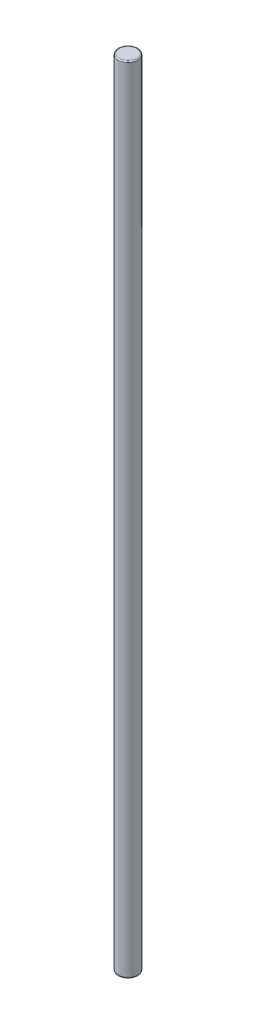
ISO-10303-21;
HEADER;
FILE_DESCRIPTION(('STEP AP214'),'2;1');
FILE_NAME('part.step','',(''),(''),'','','');
FILE_SCHEMA(('AUTOMOTIVE_DESIGN { 1 0 10303 214 1 1 1 1 }'));
ENDSEC;
DATA;
#1=APPLICATION_CONTEXT('core data for automotive mechanical design processes');
#2=APPLICATION_PROTOCOL_DEFINITION('international standard','automotive_design',2000,#1);
#3=PRODUCT_CONTEXT('',#1,'mechanical');
#4=PRODUCT('Part','Part','',(#3));
#5=PRODUCT_RELATED_PRODUCT_CATEGORY('part','',(#4));
#6=PRODUCT_DEFINITION_FORMATION('','',#4);
#7=PRODUCT_DEFINITION_CONTEXT('part definition',#1,'design');
#8=PRODUCT_DEFINITION('design','',#6,#7);
#9=PRODUCT_DEFINITION_SHAPE('','',#8);
#10=(LENGTH_UNIT() NAMED_UNIT(*) SI_UNIT(.MILLI.,.METRE.));
#11=(NAMED_UNIT(*) PLANE_ANGLE_UNIT() SI_UNIT($,.RADIAN.));
#12=(NAMED_UNIT(*) SI_UNIT($,.STERADIAN.) SOLID_ANGLE_UNIT());
#13=UNCERTAINTY_MEASURE_WITH_UNIT(LENGTH_MEASURE(1.E-05),#10,'distance_accuracy_value','');
#14=(GEOMETRIC_REPRESENTATION_CONTEXT(3) GLOBAL_UNCERTAINTY_ASSIGNED_CONTEXT((#13)) GLOBAL_UNIT_ASSIGNED_CONTEXT((#10,
#11,#12)) REPRESENTATION_CONTEXT('',''));
#15=CARTESIAN_POINT('',(0.,0.,0.));
#16=DIRECTION('',(0.,0.,1.));
#17=DIRECTION('',(1.,0.,0.));
#18=AXIS2_PLACEMENT_3D('',#15,#16,#17);
#19=CARTESIAN_POINT('',(0.,162.5,0.));
#20=DIRECTION('',(0.,-1.,0.));
#21=DIRECTION('',(0.,0.,-1.));
#22=AXIS2_PLACEMENT_3D('',#19,#20,#21);
#23=CYLINDRICAL_SURFACE('',#22,4.);
#24=CARTESIAN_POINT('',(0.,-162.,0.));
#25=DIRECTION('',(0.,1.,0.));
#26=DIRECTION('',(0.,0.,1.));
#27=AXIS2_PLACEMENT_3D('',#24,#25,#26);
#28=CIRCLE('',#27,4.);
#29=CARTESIAN_POINT('',(0.,-162.,4.));
#30=VERTEX_POINT('',#29);
#31=EDGE_CURVE('E41',#30,#30,#28,.T.);
#32=ORIENTED_EDGE('',*,*,#31,.T.);
#33=EDGE_LOOP('',(#32));
#34=FACE_BOUND('',#33,.T.);
#35=CARTESIAN_POINT('',(0.,162.,0.));
#36=DIRECTION('',(0.,1.,0.));
#37=DIRECTION('',(0.,0.,1.));
#38=AXIS2_PLACEMENT_3D('',#35,#36,#37);
#39=CIRCLE('',#38,4.);
#40=CARTESIAN_POINT('',(0.,162.,4.));
#41=VERTEX_POINT('',#40);
#42=EDGE_CURVE('E45',#41,#41,#39,.F.);
#43=ORIENTED_EDGE('',*,*,#42,.T.);
#44=EDGE_LOOP('',(#43));
#45=FACE_BOUND('',#44,.T.);
#46=ADVANCED_FACE('F30',(#34,#45),#23,.T.);
#47=CARTESIAN_POINT('',(0.,162.5,0.));
#48=DIRECTION('',(0.,1.,0.));
#49=DIRECTION('',(0.,0.,1.));
#50=AXIS2_PLACEMENT_3D('',#47,#48,#49);
#51=PLANE('',#50);
#52=CARTESIAN_POINT('',(0.,162.5,0.));
#53=DIRECTION('',(0.,1.,0.));
#54=DIRECTION('',(0.,0.,1.));
#55=AXIS2_PLACEMENT_3D('',#52,#53,#54);
#56=CIRCLE('',#55,3.5);
#57=CARTESIAN_POINT('',(0.,162.5,3.5));
#58=VERTEX_POINT('',#57);
#59=EDGE_CURVE('E10',#58,#58,#56,.T.);
#60=ORIENTED_EDGE('',*,*,#59,.T.);
#61=EDGE_LOOP('',(#60));
#62=FACE_BOUND('',#61,.T.);
#63=ADVANCED_FACE('F61',(#62),#51,.T.);
#64=CARTESIAN_POINT('',(0.,-162.5,0.));
#65=DIRECTION('',(0.,1.,0.));
#66=DIRECTION('',(0.,0.,1.));
#67=AXIS2_PLACEMENT_3D('',#64,#65,#66);
#68=PLANE('',#67);
#69=CARTESIAN_POINT('',(0.,-162.5,0.));
#70=DIRECTION('',(0.,1.,0.));
#71=DIRECTION('',(0.,0.,1.));
#72=AXIS2_PLACEMENT_3D('',#69,#70,#71);
#73=CIRCLE('',#72,3.5);
#74=CARTESIAN_POINT('',(0.,-162.5,3.5));
#75=VERTEX_POINT('',#74);
#76=EDGE_CURVE('E37',#75,#75,#73,.F.);
#77=ORIENTED_EDGE('',*,*,#76,.T.);
#78=EDGE_LOOP('',(#77));
#79=FACE_BOUND('',#78,.T.);
#80=ADVANCED_FACE('F58',(#79),#68,.F.);
#81=CARTESIAN_POINT('',(0.,-162.,0.));
#82=DIRECTION('',(0.,1.,0.));
#83=DIRECTION('',(0.,0.,1.));
#84=AXIS2_PLACEMENT_3D('',#81,#82,#83);
#85=TOROIDAL_SURFACE('',#84,3.5,0.5);
#86=ORIENTED_EDGE('',*,*,#76,.F.);
#87=EDGE_LOOP('',(#86));
#88=FACE_BOUND('',#87,.T.);
#89=ORIENTED_EDGE('',*,*,#31,.F.);
#90=EDGE_LOOP('',(#89));
#91=FACE_BOUND('',#90,.T.);
#92=ADVANCED_FACE('F54',(#88,#91),#85,.T.);
#93=CARTESIAN_POINT('',(0.,162.,0.));
#94=DIRECTION('',(0.,1.,0.));
#95=DIRECTION('',(0.,0.,1.));
#96=AXIS2_PLACEMENT_3D('',#93,#94,#95);
#97=TOROIDAL_SURFACE('',#96,3.5,0.5);
#98=ORIENTED_EDGE('',*,*,#42,.F.);
#99=EDGE_LOOP('',(#98));
#100=FACE_BOUND('',#99,.T.);
#101=ORIENTED_EDGE('',*,*,#59,.F.);
#102=EDGE_LOOP('',(#101));
#103=FACE_BOUND('',#102,.T.);
#104=ADVANCED_FACE('F32',(#100,#103),#97,.T.);
#105=CLOSED_SHELL('',(#46,#63,#80,#92,#104));
#106=MANIFOLD_SOLID_BREP('B2',#105);
#107=ADVANCED_BREP_SHAPE_REPRESENTATION('',(#18,#106),#14);
#108=SHAPE_DEFINITION_REPRESENTATION(#9,#107);
ENDSEC;
END-ISO-10303-21;
